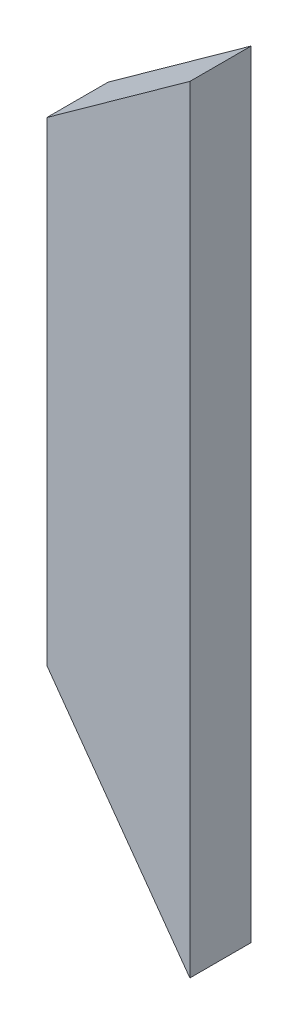
ISO-10303-21;
HEADER;
FILE_DESCRIPTION(('STEP AP214'),'2;1');
FILE_NAME('part.step','',(''),(''),'','','');
FILE_SCHEMA(('AUTOMOTIVE_DESIGN { 1 0 10303 214 1 1 1 1 }'));
ENDSEC;
DATA;
#1=APPLICATION_CONTEXT('core data for automotive mechanical design processes');
#2=APPLICATION_PROTOCOL_DEFINITION('international standard','automotive_design',2000,#1);
#3=PRODUCT_CONTEXT('',#1,'mechanical');
#4=PRODUCT('Part','Part','',(#3));
#5=PRODUCT_RELATED_PRODUCT_CATEGORY('part','',(#4));
#6=PRODUCT_DEFINITION_FORMATION('','',#4);
#7=PRODUCT_DEFINITION_CONTEXT('part definition',#1,'design');
#8=PRODUCT_DEFINITION('design','',#6,#7);
#9=PRODUCT_DEFINITION_SHAPE('','',#8);
#10=(LENGTH_UNIT() NAMED_UNIT(*) SI_UNIT(.MILLI.,.METRE.));
#11=(NAMED_UNIT(*) PLANE_ANGLE_UNIT() SI_UNIT($,.RADIAN.));
#12=(NAMED_UNIT(*) SI_UNIT($,.STERADIAN.) SOLID_ANGLE_UNIT());
#13=UNCERTAINTY_MEASURE_WITH_UNIT(LENGTH_MEASURE(1.E-05),#10,'distance_accuracy_value','');
#14=(GEOMETRIC_REPRESENTATION_CONTEXT(3) GLOBAL_UNCERTAINTY_ASSIGNED_CONTEXT((#13)) GLOBAL_UNIT_ASSIGNED_CONTEXT((#10,
#11,#12)) REPRESENTATION_CONTEXT('',''));
#15=CARTESIAN_POINT('',(0.,0.,0.));
#16=DIRECTION('',(0.,0.,1.));
#17=DIRECTION('',(1.,0.,0.));
#18=AXIS2_PLACEMENT_3D('',#15,#16,#17);
#19=CARTESIAN_POINT('',(-85.0038911653946,-61.0485065250882,38.1));
#20=DIRECTION('',(-0.812232862067414,-0.583333333333333,0.));
#21=DIRECTION('',(0.583333333333333,-0.812232862067414,0.));
#22=AXIS2_PLACEMENT_3D('',#19,#20,#21);
#23=PLANE('',#22);
#24=DIRECTION('',(-0.583333333333333,0.812232862067414,0.));
#25=VECTOR('',#24,1.);
#26=CARTESIAN_POINT('',(-85.0038911653946,-61.0485065250882,0.));
#27=LINE('',#26,#25);
#28=CARTESIAN_POINT('',(44.45,-241.3,0.));
#29=VERTEX_POINT('',#28);
#30=CARTESIAN_POINT('',(-44.45,-117.515711820926,0.));
#31=VERTEX_POINT('',#30);
#32=EDGE_CURVE('E101',#29,#31,#27,.T.);
#33=ORIENTED_EDGE('',*,*,#32,.F.);
#34=DIRECTION('',(0.,0.,-1.));
#35=VECTOR('',#34,1.);
#36=CARTESIAN_POINT('',(44.45,-241.3,38.1));
#37=LINE('',#36,#35);
#38=CARTESIAN_POINT('',(44.45,-241.3,38.1));
#39=VERTEX_POINT('',#38);
#40=EDGE_CURVE('E11',#39,#29,#37,.T.);
#41=ORIENTED_EDGE('',*,*,#40,.F.);
#42=DIRECTION('',(-0.583333333333333,0.812232862067414,0.));
#43=VECTOR('',#42,1.);
#44=CARTESIAN_POINT('',(-85.0038911653946,-61.0485065250882,38.1));
#45=LINE('',#44,#43);
#46=CARTESIAN_POINT('',(-44.45,-117.515711820926,38.1));
#47=VERTEX_POINT('',#46);
#48=EDGE_CURVE('E95',#39,#47,#45,.T.);
#49=ORIENTED_EDGE('',*,*,#48,.T.);
#50=DIRECTION('',(0.,0.,-1.));
#51=VECTOR('',#50,1.);
#52=CARTESIAN_POINT('',(-44.45,-117.515711820926,38.1));
#53=LINE('',#52,#51);
#54=EDGE_CURVE('E76',#47,#31,#53,.T.);
#55=ORIENTED_EDGE('',*,*,#54,.T.);
#56=EDGE_LOOP('',(#33,#41,#49,#55));
#57=FACE_BOUND('',#56,.T.);
#58=ADVANCED_FACE('F38',(#57),#23,.T.);
#59=CARTESIAN_POINT('',(44.45,0.,38.1));
#60=DIRECTION('',(1.,0.,0.));
#61=DIRECTION('',(0.,1.,0.));
#62=AXIS2_PLACEMENT_3D('',#59,#60,#61);
#63=PLANE('',#62);
#64=DIRECTION('',(0.,-1.,0.));
#65=VECTOR('',#64,1.);
#66=CARTESIAN_POINT('',(44.45,0.,0.));
#67=LINE('',#66,#65);
#68=CARTESIAN_POINT('',(44.45,241.3,0.));
#69=VERTEX_POINT('',#68);
#70=EDGE_CURVE('E89',#69,#29,#67,.T.);
#71=ORIENTED_EDGE('',*,*,#70,.F.);
#72=DIRECTION('',(0.,0.,-1.));
#73=VECTOR('',#72,1.);
#74=CARTESIAN_POINT('',(44.45,241.3,38.1));
#75=LINE('',#74,#73);
#76=CARTESIAN_POINT('',(44.45,241.3,38.1));
#77=VERTEX_POINT('',#76);
#78=EDGE_CURVE('E46',#77,#69,#75,.T.);
#79=ORIENTED_EDGE('',*,*,#78,.F.);
#80=DIRECTION('',(0.,-1.,0.));
#81=VECTOR('',#80,1.);
#82=CARTESIAN_POINT('',(44.45,0.,38.1));
#83=LINE('',#82,#81);
#84=EDGE_CURVE('E87',#77,#39,#83,.T.);
#85=ORIENTED_EDGE('',*,*,#84,.T.);
#86=ORIENTED_EDGE('',*,*,#40,.T.);
#87=EDGE_LOOP('',(#71,#79,#85,#86));
#88=FACE_BOUND('',#87,.T.);
#89=ADVANCED_FACE('F85',(#88),#63,.T.);
#90=CARTESIAN_POINT('',(-99.2132371531656,138.060562372638,38.1));
#91=DIRECTION('',(0.583567041820599,-0.812064965197216,0.));
#92=DIRECTION('',(0.812064965197216,0.583567041820599,0.));
#93=AXIS2_PLACEMENT_3D('',#90,#91,#92);
#94=PLANE('',#93);
#95=DIRECTION('',(-0.812064965197216,-0.583567041820599,0.));
#96=VECTOR('',#95,1.);
#97=CARTESIAN_POINT('',(-99.2132371531656,138.060562372638,0.));
#98=LINE('',#97,#96);
#99=CARTESIAN_POINT('',(-44.45,177.414581663732,0.));
#100=VERTEX_POINT('',#99);
#101=EDGE_CURVE('E69',#69,#100,#98,.T.);
#102=ORIENTED_EDGE('',*,*,#101,.T.);
#103=DIRECTION('',(0.,0.,-1.));
#104=VECTOR('',#103,1.);
#105=CARTESIAN_POINT('',(-44.45,177.414581663732,38.1));
#106=LINE('',#105,#104);
#107=CARTESIAN_POINT('',(-44.45,177.414581663732,38.1));
#108=VERTEX_POINT('',#107);
#109=EDGE_CURVE('E90',#108,#100,#106,.T.);
#110=ORIENTED_EDGE('',*,*,#109,.F.);
#111=DIRECTION('',(-0.812064965197216,-0.583567041820599,0.));
#112=VECTOR('',#111,1.);
#113=CARTESIAN_POINT('',(-99.2132371531656,138.060562372638,38.1));
#114=LINE('',#113,#112);
#115=EDGE_CURVE('E91',#77,#108,#114,.T.);
#116=ORIENTED_EDGE('',*,*,#115,.F.);
#117=ORIENTED_EDGE('',*,*,#78,.T.);
#118=EDGE_LOOP('',(#102,#110,#116,#117));
#119=FACE_BOUND('',#118,.T.);
#120=ADVANCED_FACE('F92',(#119),#94,.F.);
#121=CARTESIAN_POINT('',(-44.45,0.,38.1));
#122=DIRECTION('',(1.,0.,0.));
#123=DIRECTION('',(0.,1.,0.));
#124=AXIS2_PLACEMENT_3D('',#121,#122,#123);
#125=PLANE('',#124);
#126=DIRECTION('',(0.,-1.,0.));
#127=VECTOR('',#126,1.);
#128=CARTESIAN_POINT('',(-44.45,0.,0.));
#129=LINE('',#128,#127);
#130=EDGE_CURVE('E97',#100,#31,#129,.T.);
#131=ORIENTED_EDGE('',*,*,#130,.T.);
#132=ORIENTED_EDGE('',*,*,#54,.F.);
#133=DIRECTION('',(0.,-1.,0.));
#134=VECTOR('',#133,1.);
#135=CARTESIAN_POINT('',(-44.45,0.,38.1));
#136=LINE('',#135,#134);
#137=EDGE_CURVE('E54',#108,#47,#136,.T.);
#138=ORIENTED_EDGE('',*,*,#137,.F.);
#139=ORIENTED_EDGE('',*,*,#109,.T.);
#140=EDGE_LOOP('',(#131,#132,#138,#139));
#141=FACE_BOUND('',#140,.T.);
#142=ADVANCED_FACE('F110',(#141),#125,.F.);
#143=CARTESIAN_POINT('',(0.,0.,38.1));
#144=DIRECTION('',(0.,0.,1.));
#145=DIRECTION('',(1.,0.,0.));
#146=AXIS2_PLACEMENT_3D('',#143,#144,#145);
#147=PLANE('',#146);
#148=ORIENTED_EDGE('',*,*,#48,.F.);
#149=ORIENTED_EDGE('',*,*,#84,.F.);
#150=ORIENTED_EDGE('',*,*,#115,.T.);
#151=ORIENTED_EDGE('',*,*,#137,.T.);
#152=EDGE_LOOP('',(#148,#149,#150,#151));
#153=FACE_BOUND('',#152,.T.);
#154=ADVANCED_FACE('F94',(#153),#147,.T.);
#155=CARTESIAN_POINT('',(0.,0.,0.));
#156=DIRECTION('',(0.,0.,1.));
#157=DIRECTION('',(1.,0.,0.));
#158=AXIS2_PLACEMENT_3D('',#155,#156,#157);
#159=PLANE('',#158);
#160=ORIENTED_EDGE('',*,*,#32,.T.);
#161=ORIENTED_EDGE('',*,*,#130,.F.);
#162=ORIENTED_EDGE('',*,*,#101,.F.);
#163=ORIENTED_EDGE('',*,*,#70,.T.);
#164=EDGE_LOOP('',(#160,#161,#162,#163));
#165=FACE_BOUND('',#164,.T.);
#166=ADVANCED_FACE('F112',(#165),#159,.F.);
#167=CLOSED_SHELL('',(#58,#89,#120,#142,#154,#166));
#168=MANIFOLD_SOLID_BREP('B2',#167);
#169=ADVANCED_BREP_SHAPE_REPRESENTATION('',(#18,#168),#14);
#170=SHAPE_DEFINITION_REPRESENTATION(#9,#169);
ENDSEC;
END-ISO-10303-21;
